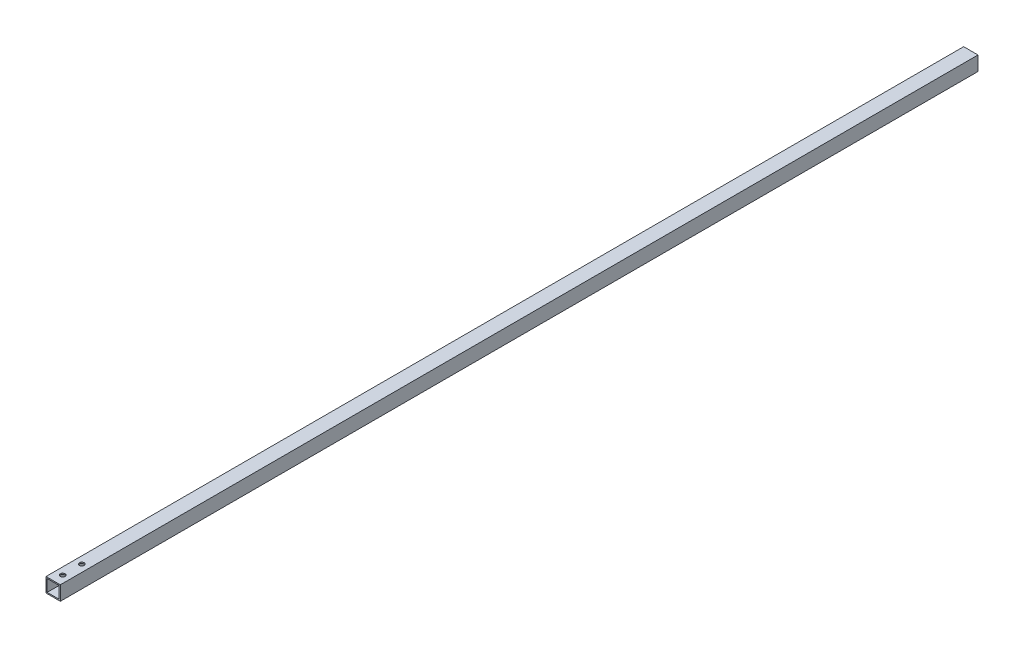
ISO-10303-21;
HEADER;
FILE_DESCRIPTION(('STEP AP214'),'2;1');
FILE_NAME('part.step','',(''),(''),'','','');
FILE_SCHEMA(('AUTOMOTIVE_DESIGN { 1 0 10303 214 1 1 1 1 }'));
ENDSEC;
DATA;
#1=APPLICATION_CONTEXT('core data for automotive mechanical design processes');
#2=APPLICATION_PROTOCOL_DEFINITION('international standard','automotive_design',2000,#1);
#3=PRODUCT_CONTEXT('',#1,'mechanical');
#4=PRODUCT('Part','Part','',(#3));
#5=PRODUCT_RELATED_PRODUCT_CATEGORY('part','',(#4));
#6=PRODUCT_DEFINITION_FORMATION('','',#4);
#7=PRODUCT_DEFINITION_CONTEXT('part definition',#1,'design');
#8=PRODUCT_DEFINITION('design','',#6,#7);
#9=PRODUCT_DEFINITION_SHAPE('','',#8);
#10=(LENGTH_UNIT() NAMED_UNIT(*) SI_UNIT(.MILLI.,.METRE.));
#11=(NAMED_UNIT(*) PLANE_ANGLE_UNIT() SI_UNIT($,.RADIAN.));
#12=(NAMED_UNIT(*) SI_UNIT($,.STERADIAN.) SOLID_ANGLE_UNIT());
#13=UNCERTAINTY_MEASURE_WITH_UNIT(LENGTH_MEASURE(1.E-05),#10,'distance_accuracy_value','');
#14=(GEOMETRIC_REPRESENTATION_CONTEXT(3) GLOBAL_UNCERTAINTY_ASSIGNED_CONTEXT((#13)) GLOBAL_UNIT_ASSIGNED_CONTEXT((#10,
#11,#12)) REPRESENTATION_CONTEXT('',''));
#15=CARTESIAN_POINT('',(0.,0.,0.));
#16=DIRECTION('',(0.,0.,1.));
#17=DIRECTION('',(1.,0.,0.));
#18=AXIS2_PLACEMENT_3D('',#15,#16,#17);
#19=CARTESIAN_POINT('',(0.,0.,609.6));
#20=DIRECTION('',(0.,0.,-1.));
#21=DIRECTION('',(-1.,0.,0.));
#22=AXIS2_PLACEMENT_3D('',#19,#20,#21);
#23=PLANE('',#22);
#24=DIRECTION('',(0.,1.,0.));
#25=VECTOR('',#24,1.);
#26=CARTESIAN_POINT('',(9.525,-9.525,609.6));
#27=LINE('',#26,#25);
#28=CARTESIAN_POINT('',(9.525,-9.525,609.6));
#29=VERTEX_POINT('',#28);
#30=CARTESIAN_POINT('',(9.525,9.525,609.6));
#31=VERTEX_POINT('',#30);
#32=EDGE_CURVE('E138',#29,#31,#27,.T.);
#33=ORIENTED_EDGE('',*,*,#32,.T.);
#34=DIRECTION('',(-1.,0.,0.));
#35=VECTOR('',#34,1.);
#36=CARTESIAN_POINT('',(-9.525,9.525,609.6));
#37=LINE('',#36,#35);
#38=CARTESIAN_POINT('',(-9.525,9.525,609.6));
#39=VERTEX_POINT('',#38);
#40=EDGE_CURVE('E141',#31,#39,#37,.T.);
#41=ORIENTED_EDGE('',*,*,#40,.T.);
#42=DIRECTION('',(0.,-1.,0.));
#43=VECTOR('',#42,1.);
#44=CARTESIAN_POINT('',(-9.525,-9.525,609.6));
#45=LINE('',#44,#43);
#46=CARTESIAN_POINT('',(-9.525,-9.525,609.6));
#47=VERTEX_POINT('',#46);
#48=EDGE_CURVE('E144',#39,#47,#45,.T.);
#49=ORIENTED_EDGE('',*,*,#48,.T.);
#50=DIRECTION('',(1.,0.,0.));
#51=VECTOR('',#50,1.);
#52=CARTESIAN_POINT('',(-9.525,-9.525,609.6));
#53=LINE('',#52,#51);
#54=EDGE_CURVE('E146',#47,#29,#53,.T.);
#55=ORIENTED_EDGE('',*,*,#54,.T.);
#56=EDGE_LOOP('',(#33,#41,#49,#55));
#57=FACE_BOUND('',#56,.T.);
#58=DIRECTION('',(0.,1.,0.));
#59=VECTOR('',#58,1.);
#60=CARTESIAN_POINT('',(7.9375,-7.9375,609.6));
#61=LINE('',#60,#59);
#62=CARTESIAN_POINT('',(7.9375,-7.9375,609.6));
#63=VERTEX_POINT('',#62);
#64=CARTESIAN_POINT('',(7.9375,7.9375,609.6));
#65=VERTEX_POINT('',#64);
#66=EDGE_CURVE('E100',#63,#65,#61,.T.);
#67=ORIENTED_EDGE('',*,*,#66,.F.);
#68=DIRECTION('',(1.,0.,0.));
#69=VECTOR('',#68,1.);
#70=CARTESIAN_POINT('',(-7.9375,-7.9375,609.6));
#71=LINE('',#70,#69);
#72=CARTESIAN_POINT('',(-7.9375,-7.9375,609.6));
#73=VERTEX_POINT('',#72);
#74=EDGE_CURVE('E122',#73,#63,#71,.T.);
#75=ORIENTED_EDGE('',*,*,#74,.F.);
#76=DIRECTION('',(0.,-1.,0.));
#77=VECTOR('',#76,1.);
#78=CARTESIAN_POINT('',(-7.9375,-7.9375,609.6));
#79=LINE('',#78,#77);
#80=CARTESIAN_POINT('',(-7.9375,7.9375,609.6));
#81=VERTEX_POINT('',#80);
#82=EDGE_CURVE('E120',#81,#73,#79,.T.);
#83=ORIENTED_EDGE('',*,*,#82,.F.);
#84=DIRECTION('',(-1.,0.,0.));
#85=VECTOR('',#84,1.);
#86=CARTESIAN_POINT('',(-7.9375,7.9375,609.6));
#87=LINE('',#86,#85);
#88=EDGE_CURVE('E108',#65,#81,#87,.T.);
#89=ORIENTED_EDGE('',*,*,#88,.F.);
#90=EDGE_LOOP('',(#67,#75,#83,#89));
#91=FACE_BOUND('',#90,.T.);
#92=ADVANCED_FACE('F33',(#57,#91),#23,.F.);
#93=CARTESIAN_POINT('',(0.,0.,-609.6));
#94=DIRECTION('',(0.,0.,-1.));
#95=DIRECTION('',(-1.,0.,0.));
#96=AXIS2_PLACEMENT_3D('',#93,#94,#95);
#97=PLANE('',#96);
#98=DIRECTION('',(0.,1.,0.));
#99=VECTOR('',#98,1.);
#100=CARTESIAN_POINT('',(9.525,-9.525,-609.6));
#101=LINE('',#100,#99);
#102=CARTESIAN_POINT('',(9.525,-9.525,-609.6));
#103=VERTEX_POINT('',#102);
#104=CARTESIAN_POINT('',(9.525,9.525,-609.6));
#105=VERTEX_POINT('',#104);
#106=EDGE_CURVE('E116',#103,#105,#101,.T.);
#107=ORIENTED_EDGE('',*,*,#106,.F.);
#108=DIRECTION('',(1.,0.,0.));
#109=VECTOR('',#108,1.);
#110=CARTESIAN_POINT('',(-9.525,-9.525,-609.6));
#111=LINE('',#110,#109);
#112=CARTESIAN_POINT('',(-9.525,-9.525,-609.6));
#113=VERTEX_POINT('',#112);
#114=EDGE_CURVE('E142',#113,#103,#111,.T.);
#115=ORIENTED_EDGE('',*,*,#114,.F.);
#116=DIRECTION('',(0.,-1.,0.));
#117=VECTOR('',#116,1.);
#118=CARTESIAN_POINT('',(-9.525,-9.525,-609.6));
#119=LINE('',#118,#117);
#120=CARTESIAN_POINT('',(-9.525,9.525,-609.6));
#121=VERTEX_POINT('',#120);
#122=EDGE_CURVE('E153',#121,#113,#119,.T.);
#123=ORIENTED_EDGE('',*,*,#122,.F.);
#124=DIRECTION('',(-1.,0.,0.));
#125=VECTOR('',#124,1.);
#126=CARTESIAN_POINT('',(-9.525,9.525,-609.6));
#127=LINE('',#126,#125);
#128=EDGE_CURVE('E151',#105,#121,#127,.T.);
#129=ORIENTED_EDGE('',*,*,#128,.F.);
#130=EDGE_LOOP('',(#107,#115,#123,#129));
#131=FACE_BOUND('',#130,.T.);
#132=DIRECTION('',(1.,0.,0.));
#133=VECTOR('',#132,1.);
#134=CARTESIAN_POINT('',(-7.9375,-7.9375,-609.6));
#135=LINE('',#134,#133);
#136=CARTESIAN_POINT('',(-7.9375,-7.9375,-609.6));
#137=VERTEX_POINT('',#136);
#138=CARTESIAN_POINT('',(7.9375,-7.9375,-609.6));
#139=VERTEX_POINT('',#138);
#140=EDGE_CURVE('E109',#137,#139,#135,.T.);
#141=ORIENTED_EDGE('',*,*,#140,.T.);
#142=DIRECTION('',(0.,1.,0.));
#143=VECTOR('',#142,1.);
#144=CARTESIAN_POINT('',(7.9375,-7.9375,-609.6));
#145=LINE('',#144,#143);
#146=CARTESIAN_POINT('',(7.9375,7.9375,-609.6));
#147=VERTEX_POINT('',#146);
#148=EDGE_CURVE('E58',#139,#147,#145,.T.);
#149=ORIENTED_EDGE('',*,*,#148,.T.);
#150=DIRECTION('',(-1.,0.,0.));
#151=VECTOR('',#150,1.);
#152=CARTESIAN_POINT('',(-7.9375,7.9375,-609.6));
#153=LINE('',#152,#151);
#154=CARTESIAN_POINT('',(-7.9375,7.9375,-609.6));
#155=VERTEX_POINT('',#154);
#156=EDGE_CURVE('E115',#147,#155,#153,.T.);
#157=ORIENTED_EDGE('',*,*,#156,.T.);
#158=DIRECTION('',(0.,-1.,0.));
#159=VECTOR('',#158,1.);
#160=CARTESIAN_POINT('',(-7.9375,-7.9375,-609.6));
#161=LINE('',#160,#159);
#162=EDGE_CURVE('E130',#155,#137,#161,.T.);
#163=ORIENTED_EDGE('',*,*,#162,.T.);
#164=EDGE_LOOP('',(#141,#149,#157,#163));
#165=FACE_BOUND('',#164,.T.);
#166=ADVANCED_FACE('F200',(#131,#165),#97,.T.);
#167=CARTESIAN_POINT('',(9.525,-9.525,609.6));
#168=DIRECTION('',(-1.,0.,0.));
#169=DIRECTION('',(0.,0.,1.));
#170=AXIS2_PLACEMENT_3D('',#167,#168,#169);
#171=PLANE('',#170);
#172=ORIENTED_EDGE('',*,*,#106,.T.);
#173=DIRECTION('',(0.,0.,-1.));
#174=VECTOR('',#173,1.);
#175=CARTESIAN_POINT('',(9.525,9.525,609.6));
#176=LINE('',#175,#174);
#177=EDGE_CURVE('E11',#31,#105,#176,.T.);
#178=ORIENTED_EDGE('',*,*,#177,.F.);
#179=ORIENTED_EDGE('',*,*,#32,.F.);
#180=DIRECTION('',(0.,0.,-1.));
#181=VECTOR('',#180,1.);
#182=CARTESIAN_POINT('',(9.525,-9.525,609.6));
#183=LINE('',#182,#181);
#184=EDGE_CURVE('E148',#29,#103,#183,.T.);
#185=ORIENTED_EDGE('',*,*,#184,.T.);
#186=EDGE_LOOP('',(#172,#178,#179,#185));
#187=FACE_BOUND('',#186,.T.);
#188=ADVANCED_FACE('F35',(#187),#171,.F.);
#189=CARTESIAN_POINT('',(-9.525,9.525,609.6));
#190=DIRECTION('',(0.,-1.,0.));
#191=DIRECTION('',(0.,0.,-1.));
#192=AXIS2_PLACEMENT_3D('',#189,#190,#191);
#193=PLANE('',#192);
#194=CARTESIAN_POINT('',(0.,9.525,596.9));
#195=DIRECTION('',(0.,1.,0.));
#196=DIRECTION('',(0.,0.,1.));
#197=AXIS2_PLACEMENT_3D('',#194,#195,#196);
#198=CIRCLE('',#197,3.175);
#199=CARTESIAN_POINT('',(0.,9.525,600.075));
#200=VERTEX_POINT('',#199);
#201=EDGE_CURVE('E171',#200,#200,#198,.T.);
#202=ORIENTED_EDGE('',*,*,#201,.F.);
#203=EDGE_LOOP('',(#202));
#204=FACE_BOUND('',#203,.T.);
#205=CARTESIAN_POINT('',(0.,9.525,571.5));
#206=DIRECTION('',(0.,1.,0.));
#207=DIRECTION('',(0.,0.,1.));
#208=AXIS2_PLACEMENT_3D('',#205,#206,#207);
#209=CIRCLE('',#208,3.175);
#210=CARTESIAN_POINT('',(0.,9.525,574.675));
#211=VERTEX_POINT('',#210);
#212=EDGE_CURVE('E179',#211,#211,#209,.T.);
#213=ORIENTED_EDGE('',*,*,#212,.F.);
#214=EDGE_LOOP('',(#213));
#215=FACE_BOUND('',#214,.T.);
#216=ORIENTED_EDGE('',*,*,#128,.T.);
#217=DIRECTION('',(0.,0.,-1.));
#218=VECTOR('',#217,1.);
#219=CARTESIAN_POINT('',(-9.525,9.525,609.6));
#220=LINE('',#219,#218);
#221=EDGE_CURVE('E42',#39,#121,#220,.T.);
#222=ORIENTED_EDGE('',*,*,#221,.F.);
#223=ORIENTED_EDGE('',*,*,#40,.F.);
#224=ORIENTED_EDGE('',*,*,#177,.T.);
#225=EDGE_LOOP('',(#216,#222,#223,#224));
#226=FACE_BOUND('',#225,.T.);
#227=ADVANCED_FACE('F224',(#204,#215,#226),#193,.F.);
#228=CARTESIAN_POINT('',(-9.525,-9.525,609.6));
#229=DIRECTION('',(1.,0.,0.));
#230=DIRECTION('',(0.,0.,-1.));
#231=AXIS2_PLACEMENT_3D('',#228,#229,#230);
#232=PLANE('',#231);
#233=ORIENTED_EDGE('',*,*,#122,.T.);
#234=DIRECTION('',(0.,0.,-1.));
#235=VECTOR('',#234,1.);
#236=CARTESIAN_POINT('',(-9.525,-9.525,609.6));
#237=LINE('',#236,#235);
#238=EDGE_CURVE('E158',#47,#113,#237,.T.);
#239=ORIENTED_EDGE('',*,*,#238,.F.);
#240=ORIENTED_EDGE('',*,*,#48,.F.);
#241=ORIENTED_EDGE('',*,*,#221,.T.);
#242=EDGE_LOOP('',(#233,#239,#240,#241));
#243=FACE_BOUND('',#242,.T.);
#244=ADVANCED_FACE('F222',(#243),#232,.F.);
#245=CARTESIAN_POINT('',(-9.525,-9.525,609.6));
#246=DIRECTION('',(0.,1.,0.));
#247=DIRECTION('',(0.,0.,1.));
#248=AXIS2_PLACEMENT_3D('',#245,#246,#247);
#249=PLANE('',#248);
#250=CARTESIAN_POINT('',(0.,-9.525,596.9));
#251=DIRECTION('',(0.,1.,0.));
#252=DIRECTION('',(0.,0.,1.));
#253=AXIS2_PLACEMENT_3D('',#250,#251,#252);
#254=CIRCLE('',#253,3.175);
#255=CARTESIAN_POINT('',(0.,-9.525,600.075));
#256=VERTEX_POINT('',#255);
#257=EDGE_CURVE('E165',#256,#256,#254,.T.);
#258=ORIENTED_EDGE('',*,*,#257,.T.);
#259=EDGE_LOOP('',(#258));
#260=FACE_BOUND('',#259,.T.);
#261=CARTESIAN_POINT('',(0.,-9.525,571.5));
#262=DIRECTION('',(0.,1.,0.));
#263=DIRECTION('',(0.,0.,1.));
#264=AXIS2_PLACEMENT_3D('',#261,#262,#263);
#265=CIRCLE('',#264,3.175);
#266=CARTESIAN_POINT('',(0.,-9.525,574.675));
#267=VERTEX_POINT('',#266);
#268=EDGE_CURVE('E176',#267,#267,#265,.T.);
#269=ORIENTED_EDGE('',*,*,#268,.T.);
#270=EDGE_LOOP('',(#269));
#271=FACE_BOUND('',#270,.T.);
#272=ORIENTED_EDGE('',*,*,#114,.T.);
#273=ORIENTED_EDGE('',*,*,#184,.F.);
#274=ORIENTED_EDGE('',*,*,#54,.F.);
#275=ORIENTED_EDGE('',*,*,#238,.T.);
#276=EDGE_LOOP('',(#272,#273,#274,#275));
#277=FACE_BOUND('',#276,.T.);
#278=ADVANCED_FACE('F219',(#260,#271,#277),#249,.F.);
#279=CARTESIAN_POINT('',(7.9375,-7.9375,609.6));
#280=DIRECTION('',(-1.,0.,0.));
#281=DIRECTION('',(0.,0.,1.));
#282=AXIS2_PLACEMENT_3D('',#279,#280,#281);
#283=PLANE('',#282);
#284=ORIENTED_EDGE('',*,*,#148,.F.);
#285=DIRECTION('',(0.,0.,-1.));
#286=VECTOR('',#285,1.);
#287=CARTESIAN_POINT('',(7.9375,-7.9375,609.6));
#288=LINE('',#287,#286);
#289=EDGE_CURVE('E104',#63,#139,#288,.T.);
#290=ORIENTED_EDGE('',*,*,#289,.F.);
#291=ORIENTED_EDGE('',*,*,#66,.T.);
#292=DIRECTION('',(0.,0.,-1.));
#293=VECTOR('',#292,1.);
#294=CARTESIAN_POINT('',(7.9375,7.9375,609.6));
#295=LINE('',#294,#293);
#296=EDGE_CURVE('E103',#65,#147,#295,.T.);
#297=ORIENTED_EDGE('',*,*,#296,.T.);
#298=EDGE_LOOP('',(#284,#290,#291,#297));
#299=FACE_BOUND('',#298,.T.);
#300=ADVANCED_FACE('F102',(#299),#283,.T.);
#301=CARTESIAN_POINT('',(-7.9375,7.9375,609.6));
#302=DIRECTION('',(0.,-1.,0.));
#303=DIRECTION('',(0.,0.,-1.));
#304=AXIS2_PLACEMENT_3D('',#301,#302,#303);
#305=PLANE('',#304);
#306=CARTESIAN_POINT('',(0.,7.93749999999999,596.9));
#307=DIRECTION('',(0.,-1.,0.));
#308=DIRECTION('',(0.,0.,-1.));
#309=AXIS2_PLACEMENT_3D('',#306,#307,#308);
#310=CIRCLE('',#309,3.175);
#311=CARTESIAN_POINT('',(0.,7.93749999999999,600.075));
#312=VERTEX_POINT('',#311);
#313=EDGE_CURVE('E128',#312,#312,#310,.T.);
#314=ORIENTED_EDGE('',*,*,#313,.F.);
#315=EDGE_LOOP('',(#314));
#316=FACE_BOUND('',#315,.T.);
#317=CARTESIAN_POINT('',(0.,7.93749999999999,571.5));
#318=DIRECTION('',(0.,-1.,0.));
#319=DIRECTION('',(0.,0.,-1.));
#320=AXIS2_PLACEMENT_3D('',#317,#318,#319);
#321=CIRCLE('',#320,3.175);
#322=CARTESIAN_POINT('',(0.,7.93749999999999,574.675));
#323=VERTEX_POINT('',#322);
#324=EDGE_CURVE('E164',#323,#323,#321,.T.);
#325=ORIENTED_EDGE('',*,*,#324,.F.);
#326=EDGE_LOOP('',(#325));
#327=FACE_BOUND('',#326,.T.);
#328=ORIENTED_EDGE('',*,*,#156,.F.);
#329=ORIENTED_EDGE('',*,*,#296,.F.);
#330=ORIENTED_EDGE('',*,*,#88,.T.);
#331=DIRECTION('',(0.,0.,-1.));
#332=VECTOR('',#331,1.);
#333=CARTESIAN_POINT('',(-7.9375,7.9375,609.6));
#334=LINE('',#333,#332);
#335=EDGE_CURVE('E117',#81,#155,#334,.T.);
#336=ORIENTED_EDGE('',*,*,#335,.T.);
#337=EDGE_LOOP('',(#328,#329,#330,#336));
#338=FACE_BOUND('',#337,.T.);
#339=ADVANCED_FACE('F112',(#316,#327,#338),#305,.T.);
#340=CARTESIAN_POINT('',(-7.9375,-7.9375,609.6));
#341=DIRECTION('',(1.,0.,0.));
#342=DIRECTION('',(0.,0.,-1.));
#343=AXIS2_PLACEMENT_3D('',#340,#341,#342);
#344=PLANE('',#343);
#345=ORIENTED_EDGE('',*,*,#162,.F.);
#346=ORIENTED_EDGE('',*,*,#335,.F.);
#347=ORIENTED_EDGE('',*,*,#82,.T.);
#348=DIRECTION('',(0.,0.,-1.));
#349=VECTOR('',#348,1.);
#350=CARTESIAN_POINT('',(-7.9375,-7.9375,609.6));
#351=LINE('',#350,#349);
#352=EDGE_CURVE('E50',#73,#137,#351,.T.);
#353=ORIENTED_EDGE('',*,*,#352,.T.);
#354=EDGE_LOOP('',(#345,#346,#347,#353));
#355=FACE_BOUND('',#354,.T.);
#356=ADVANCED_FACE('F196',(#355),#344,.T.);
#357=CARTESIAN_POINT('',(-7.9375,-7.9375,609.6));
#358=DIRECTION('',(0.,1.,0.));
#359=DIRECTION('',(0.,0.,1.));
#360=AXIS2_PLACEMENT_3D('',#357,#358,#359);
#361=PLANE('',#360);
#362=CARTESIAN_POINT('',(0.,-7.9375,596.9));
#363=DIRECTION('',(0.,1.,0.));
#364=DIRECTION('',(0.,0.,1.));
#365=AXIS2_PLACEMENT_3D('',#362,#363,#364);
#366=CIRCLE('',#365,3.175);
#367=CARTESIAN_POINT('',(0.,-7.9375,600.075));
#368=VERTEX_POINT('',#367);
#369=EDGE_CURVE('E37',#368,#368,#366,.T.);
#370=ORIENTED_EDGE('',*,*,#369,.F.);
#371=EDGE_LOOP('',(#370));
#372=FACE_BOUND('',#371,.T.);
#373=CARTESIAN_POINT('',(0.,-7.9375,571.5));
#374=DIRECTION('',(0.,1.,0.));
#375=DIRECTION('',(0.,0.,1.));
#376=AXIS2_PLACEMENT_3D('',#373,#374,#375);
#377=CIRCLE('',#376,3.175);
#378=CARTESIAN_POINT('',(0.,-7.9375,574.675));
#379=VERTEX_POINT('',#378);
#380=EDGE_CURVE('E162',#379,#379,#377,.T.);
#381=ORIENTED_EDGE('',*,*,#380,.F.);
#382=EDGE_LOOP('',(#381));
#383=FACE_BOUND('',#382,.T.);
#384=ORIENTED_EDGE('',*,*,#140,.F.);
#385=ORIENTED_EDGE('',*,*,#352,.F.);
#386=ORIENTED_EDGE('',*,*,#74,.T.);
#387=ORIENTED_EDGE('',*,*,#289,.T.);
#388=EDGE_LOOP('',(#384,#385,#386,#387));
#389=FACE_BOUND('',#388,.T.);
#390=ADVANCED_FACE('F192',(#372,#383,#389),#361,.T.);
#391=CARTESIAN_POINT('',(0.,-9.525,571.5));
#392=DIRECTION('',(0.,1.,0.));
#393=DIRECTION('',(0.,0.,1.));
#394=AXIS2_PLACEMENT_3D('',#391,#392,#393);
#395=CYLINDRICAL_SURFACE('',#394,3.175);
#396=CARTESIAN_POINT('',(0.,-7.9375,574.675));
#397=CARTESIAN_POINT('',(0.,-7.95403645833333,574.675));
#398=CARTESIAN_POINT('',(0.,-7.97057291666667,574.675));
#399=CARTESIAN_POINT('',(0.,-8.00364583333333,574.675));
#400=CARTESIAN_POINT('',(0.,-8.02018229166667,574.675));
#401=CARTESIAN_POINT('',(0.,-8.05325520833333,574.675));
#402=CARTESIAN_POINT('',(0.,-8.06979166666667,574.675));
#403=CARTESIAN_POINT('',(0.,-8.10286458333333,574.675));
#404=CARTESIAN_POINT('',(0.,-8.11940104166667,574.675));
#405=CARTESIAN_POINT('',(0.,-8.15247395833333,574.675));
#406=CARTESIAN_POINT('',(0.,-8.16901041666667,574.675));
#407=CARTESIAN_POINT('',(0.,-8.20208333333333,574.675));
#408=CARTESIAN_POINT('',(0.,-8.21861979166667,574.675));
#409=CARTESIAN_POINT('',(0.,-8.25169270833333,574.675));
#410=CARTESIAN_POINT('',(0.,-8.26822916666667,574.675));
#411=CARTESIAN_POINT('',(0.,-8.30130208333333,574.675));
#412=CARTESIAN_POINT('',(0.,-8.31783854166667,574.675));
#413=CARTESIAN_POINT('',(0.,-8.35091145833333,574.675));
#414=CARTESIAN_POINT('',(0.,-8.36744791666667,574.675));
#415=CARTESIAN_POINT('',(0.,-8.40052083333333,574.675));
#416=CARTESIAN_POINT('',(0.,-8.41705729166667,574.675));
#417=CARTESIAN_POINT('',(0.,-8.45013020833333,574.675));
#418=CARTESIAN_POINT('',(0.,-8.46666666666667,574.675));
#419=CARTESIAN_POINT('',(0.,-8.49973958333333,574.675));
#420=CARTESIAN_POINT('',(0.,-8.51627604166667,574.675));
#421=CARTESIAN_POINT('',(0.,-8.54934895833333,574.675));
#422=CARTESIAN_POINT('',(0.,-8.56588541666667,574.675));
#423=CARTESIAN_POINT('',(0.,-8.59895833333333,574.675));
#424=CARTESIAN_POINT('',(0.,-8.61549479166667,574.675));
#425=CARTESIAN_POINT('',(0.,-8.64856770833333,574.675));
#426=CARTESIAN_POINT('',(0.,-8.66510416666667,574.675));
#427=CARTESIAN_POINT('',(0.,-8.69817708333333,574.675));
#428=CARTESIAN_POINT('',(0.,-8.71471354166667,574.675));
#429=CARTESIAN_POINT('',(0.,-8.74778645833333,574.675));
#430=CARTESIAN_POINT('',(0.,-8.76432291666667,574.675));
#431=CARTESIAN_POINT('',(0.,-8.79739583333333,574.675));
#432=CARTESIAN_POINT('',(0.,-8.81393229166667,574.675));
#433=CARTESIAN_POINT('',(0.,-8.84700520833333,574.675));
#434=CARTESIAN_POINT('',(0.,-8.86354166666667,574.675));
#435=CARTESIAN_POINT('',(0.,-8.89661458333333,574.675));
#436=CARTESIAN_POINT('',(0.,-8.91315104166667,574.675));
#437=CARTESIAN_POINT('',(0.,-8.94622395833333,574.675));
#438=CARTESIAN_POINT('',(0.,-8.96276041666667,574.675));
#439=CARTESIAN_POINT('',(0.,-8.99583333333334,574.675));
#440=CARTESIAN_POINT('',(0.,-9.01236979166667,574.675));
#441=CARTESIAN_POINT('',(0.,-9.04544270833333,574.675));
#442=CARTESIAN_POINT('',(0.,-9.06197916666667,574.675));
#443=CARTESIAN_POINT('',(0.,-9.09505208333333,574.675));
#444=CARTESIAN_POINT('',(0.,-9.11158854166667,574.675));
#445=CARTESIAN_POINT('',(0.,-9.14466145833333,574.675));
#446=CARTESIAN_POINT('',(0.,-9.16119791666667,574.675));
#447=CARTESIAN_POINT('',(0.,-9.19427083333333,574.675));
#448=CARTESIAN_POINT('',(0.,-9.21080729166667,574.675));
#449=CARTESIAN_POINT('',(0.,-9.24388020833333,574.675));
#450=CARTESIAN_POINT('',(0.,-9.26041666666667,574.675));
#451=CARTESIAN_POINT('',(0.,-9.29348958333333,574.675));
#452=CARTESIAN_POINT('',(0.,-9.31002604166667,574.675));
#453=CARTESIAN_POINT('',(0.,-9.34309895833333,574.675));
#454=CARTESIAN_POINT('',(0.,-9.35963541666667,574.675));
#455=CARTESIAN_POINT('',(0.,-9.39270833333333,574.675));
#456=CARTESIAN_POINT('',(0.,-9.40924479166667,574.675));
#457=CARTESIAN_POINT('',(0.,-9.44231770833333,574.675));
#458=CARTESIAN_POINT('',(0.,-9.45885416666667,574.675));
#459=CARTESIAN_POINT('',(0.,-9.49192708333333,574.675));
#460=CARTESIAN_POINT('',(0.,-9.50846354166667,574.675));
#461=CARTESIAN_POINT('',(0.,-9.525,574.675));
#462=B_SPLINE_CURVE_WITH_KNOTS('',3,(#396,#397,#398,#399,#400,#401,#402,#403,#404,#405,#406,
#407,#408,#409,#410,#411,#412,#413,#414,#415,#416,#417,#418,#419,#420,#421,#422,#423,#424,#425,
#426,#427,#428,#429,#430,#431,#432,#433,#434,#435,#436,#437,#438,#439,#440,#441,#442,#443,#444,
#445,#446,#447,#448,#449,#450,#451,#452,#453,#454,#455,#456,#457,#458,#459,#460,#461),
.UNSPECIFIED.,.F.,.F.,(4,2,2,2,2,2,2,2,2,2,2,2,2,2,2,2,2,2,2,2,2,2,2,2,2,2,2,2,2,2,2,2,4),(0.,
0.0496093750000006,0.0992187500000012,0.148828125000002,0.198437500000001,0.248046875000001,
0.297656250000002,0.347265625000001,0.396875000000001,0.446484375000002,0.496093750000001,
0.545703125000002,0.595312500000002,0.644921875000001,0.694531250000002,0.744140625000002,
0.793750000000001,0.843359375000002,0.892968750000002,0.942578125000001,0.992187500000002,
1.041796875,1.09140625,1.141015625,1.190625,1.240234375,1.28984375,1.339453125,1.3890625,
1.438671875,1.48828125,1.537890625,1.5875),.UNSPECIFIED.);
#463=EDGE_CURVE('BSEAM195',#379,#267,#462,.T.);
#464=ORIENTED_EDGE('',*,*,#380,.T.);
#465=ORIENTED_EDGE('',*,*,#268,.F.);
#466=ORIENTED_EDGE('',*,*,#463,.T.);
#467=ORIENTED_EDGE('',*,*,#463,.F.);
#468=EDGE_LOOP('',(#464,#466,#465,#467));
#469=FACE_BOUND('',#468,.T.);
#470=ADVANCED_FACE('F195',(#469),#395,.F.);
#471=CARTESIAN_POINT('',(0.,-9.525,596.9));
#472=DIRECTION('',(0.,1.,0.));
#473=DIRECTION('',(0.,0.,1.));
#474=AXIS2_PLACEMENT_3D('',#471,#472,#473);
#475=CYLINDRICAL_SURFACE('',#474,3.175);
#476=CARTESIAN_POINT('',(0.,-7.9375,600.075));
#477=CARTESIAN_POINT('',(0.,-7.95403645833333,600.075));
#478=CARTESIAN_POINT('',(0.,-7.97057291666667,600.075));
#479=CARTESIAN_POINT('',(0.,-8.00364583333333,600.075));
#480=CARTESIAN_POINT('',(0.,-8.02018229166667,600.075));
#481=CARTESIAN_POINT('',(0.,-8.05325520833333,600.075));
#482=CARTESIAN_POINT('',(0.,-8.06979166666667,600.075));
#483=CARTESIAN_POINT('',(0.,-8.10286458333333,600.075));
#484=CARTESIAN_POINT('',(0.,-8.11940104166667,600.075));
#485=CARTESIAN_POINT('',(0.,-8.15247395833333,600.075));
#486=CARTESIAN_POINT('',(0.,-8.16901041666667,600.075));
#487=CARTESIAN_POINT('',(0.,-8.20208333333333,600.075));
#488=CARTESIAN_POINT('',(0.,-8.21861979166667,600.075));
#489=CARTESIAN_POINT('',(0.,-8.25169270833333,600.075));
#490=CARTESIAN_POINT('',(0.,-8.26822916666667,600.075));
#491=CARTESIAN_POINT('',(0.,-8.30130208333333,600.075));
#492=CARTESIAN_POINT('',(0.,-8.31783854166667,600.075));
#493=CARTESIAN_POINT('',(0.,-8.35091145833333,600.075));
#494=CARTESIAN_POINT('',(0.,-8.36744791666667,600.075));
#495=CARTESIAN_POINT('',(0.,-8.40052083333333,600.075));
#496=CARTESIAN_POINT('',(0.,-8.41705729166667,600.075));
#497=CARTESIAN_POINT('',(0.,-8.45013020833333,600.075));
#498=CARTESIAN_POINT('',(0.,-8.46666666666667,600.075));
#499=CARTESIAN_POINT('',(0.,-8.49973958333333,600.075));
#500=CARTESIAN_POINT('',(0.,-8.51627604166667,600.075));
#501=CARTESIAN_POINT('',(0.,-8.54934895833333,600.075));
#502=CARTESIAN_POINT('',(0.,-8.56588541666667,600.075));
#503=CARTESIAN_POINT('',(0.,-8.59895833333333,600.075));
#504=CARTESIAN_POINT('',(0.,-8.61549479166667,600.075));
#505=CARTESIAN_POINT('',(0.,-8.64856770833333,600.075));
#506=CARTESIAN_POINT('',(0.,-8.66510416666667,600.075));
#507=CARTESIAN_POINT('',(0.,-8.69817708333333,600.075));
#508=CARTESIAN_POINT('',(0.,-8.71471354166667,600.075));
#509=CARTESIAN_POINT('',(0.,-8.74778645833333,600.075));
#510=CARTESIAN_POINT('',(0.,-8.76432291666667,600.075));
#511=CARTESIAN_POINT('',(0.,-8.79739583333333,600.075));
#512=CARTESIAN_POINT('',(0.,-8.81393229166667,600.075));
#513=CARTESIAN_POINT('',(0.,-8.84700520833333,600.075));
#514=CARTESIAN_POINT('',(0.,-8.86354166666667,600.075));
#515=CARTESIAN_POINT('',(0.,-8.89661458333333,600.075));
#516=CARTESIAN_POINT('',(0.,-8.91315104166667,600.075));
#517=CARTESIAN_POINT('',(0.,-8.94622395833333,600.075));
#518=CARTESIAN_POINT('',(0.,-8.96276041666667,600.075));
#519=CARTESIAN_POINT('',(0.,-8.99583333333334,600.075));
#520=CARTESIAN_POINT('',(0.,-9.01236979166667,600.075));
#521=CARTESIAN_POINT('',(0.,-9.04544270833333,600.075));
#522=CARTESIAN_POINT('',(0.,-9.06197916666667,600.075));
#523=CARTESIAN_POINT('',(0.,-9.09505208333333,600.075));
#524=CARTESIAN_POINT('',(0.,-9.11158854166667,600.075));
#525=CARTESIAN_POINT('',(0.,-9.14466145833333,600.075));
#526=CARTESIAN_POINT('',(0.,-9.16119791666667,600.075));
#527=CARTESIAN_POINT('',(0.,-9.19427083333333,600.075));
#528=CARTESIAN_POINT('',(0.,-9.21080729166667,600.075));
#529=CARTESIAN_POINT('',(0.,-9.24388020833333,600.075));
#530=CARTESIAN_POINT('',(0.,-9.26041666666667,600.075));
#531=CARTESIAN_POINT('',(0.,-9.29348958333333,600.075));
#532=CARTESIAN_POINT('',(0.,-9.31002604166667,600.075));
#533=CARTESIAN_POINT('',(0.,-9.34309895833333,600.075));
#534=CARTESIAN_POINT('',(0.,-9.35963541666667,600.075));
#535=CARTESIAN_POINT('',(0.,-9.39270833333333,600.075));
#536=CARTESIAN_POINT('',(0.,-9.40924479166667,600.075));
#537=CARTESIAN_POINT('',(0.,-9.44231770833333,600.075));
#538=CARTESIAN_POINT('',(0.,-9.45885416666667,600.075));
#539=CARTESIAN_POINT('',(0.,-9.49192708333333,600.075));
#540=CARTESIAN_POINT('',(0.,-9.50846354166667,600.075));
#541=CARTESIAN_POINT('',(0.,-9.525,600.075));
#542=B_SPLINE_CURVE_WITH_KNOTS('',3,(#476,#477,#478,#479,#480,#481,#482,#483,#484,#485,#486,
#487,#488,#489,#490,#491,#492,#493,#494,#495,#496,#497,#498,#499,#500,#501,#502,#503,#504,#505,
#506,#507,#508,#509,#510,#511,#512,#513,#514,#515,#516,#517,#518,#519,#520,#521,#522,#523,#524,
#525,#526,#527,#528,#529,#530,#531,#532,#533,#534,#535,#536,#537,#538,#539,#540,#541),
.UNSPECIFIED.,.F.,.F.,(4,2,2,2,2,2,2,2,2,2,2,2,2,2,2,2,2,2,2,2,2,2,2,2,2,2,2,2,2,2,2,2,4),(0.,
0.0496093750000006,0.0992187500000012,0.148828125000002,0.198437500000001,0.248046875000001,
0.297656250000002,0.347265625000001,0.396875000000001,0.446484375000002,0.496093750000001,
0.545703125000002,0.595312500000002,0.644921875000001,0.694531250000002,0.744140625000002,
0.793750000000001,0.843359375000002,0.892968750000002,0.942578125000001,0.992187500000002,
1.041796875,1.09140625,1.141015625,1.190625,1.240234375,1.28984375,1.339453125,1.3890625,
1.438671875,1.48828125,1.537890625,1.5875),.UNSPECIFIED.);
#543=EDGE_CURVE('BSEAM189',#368,#256,#542,.T.);
#544=ORIENTED_EDGE('',*,*,#369,.T.);
#545=ORIENTED_EDGE('',*,*,#257,.F.);
#546=ORIENTED_EDGE('',*,*,#543,.T.);
#547=ORIENTED_EDGE('',*,*,#543,.F.);
#548=EDGE_LOOP('',(#544,#546,#545,#547));
#549=FACE_BOUND('',#548,.T.);
#550=ADVANCED_FACE('F189',(#549),#475,.F.);
#551=CARTESIAN_POINT('',(0.,7.93749999999999,574.675));
#552=CARTESIAN_POINT('',(0.,7.95403645833333,574.675));
#553=CARTESIAN_POINT('',(0.,7.97057291666666,574.675));
#554=CARTESIAN_POINT('',(0.,8.00364583333333,574.675));
#555=CARTESIAN_POINT('',(0.,8.02018229166666,574.675));
#556=CARTESIAN_POINT('',(0.,8.05325520833333,574.675));
#557=CARTESIAN_POINT('',(0.,8.06979166666666,574.675));
#558=CARTESIAN_POINT('',(0.,8.10286458333333,574.675));
#559=CARTESIAN_POINT('',(0.,8.11940104166666,574.675));
#560=CARTESIAN_POINT('',(0.,8.15247395833333,574.675));
#561=CARTESIAN_POINT('',(0.,8.16901041666666,574.675));
#562=CARTESIAN_POINT('',(0.,8.20208333333333,574.675));
#563=CARTESIAN_POINT('',(0.,8.21861979166666,574.675));
#564=CARTESIAN_POINT('',(0.,8.25169270833333,574.675));
#565=CARTESIAN_POINT('',(0.,8.26822916666666,574.675));
#566=CARTESIAN_POINT('',(0.,8.30130208333333,574.675));
#567=CARTESIAN_POINT('',(0.,8.31783854166666,574.675));
#568=CARTESIAN_POINT('',(0.,8.35091145833333,574.675));
#569=CARTESIAN_POINT('',(0.,8.36744791666666,574.675));
#570=CARTESIAN_POINT('',(0.,8.40052083333333,574.675));
#571=CARTESIAN_POINT('',(0.,8.41705729166666,574.675));
#572=CARTESIAN_POINT('',(0.,8.45013020833333,574.675));
#573=CARTESIAN_POINT('',(0.,8.46666666666666,574.675));
#574=CARTESIAN_POINT('',(0.,8.49973958333333,574.675));
#575=CARTESIAN_POINT('',(0.,8.51627604166666,574.675));
#576=CARTESIAN_POINT('',(0.,8.54934895833333,574.675));
#577=CARTESIAN_POINT('',(0.,8.56588541666666,574.675));
#578=CARTESIAN_POINT('',(0.,8.59895833333333,574.675));
#579=CARTESIAN_POINT('',(0.,8.61549479166666,574.675));
#580=CARTESIAN_POINT('',(0.,8.64856770833333,574.675));
#581=CARTESIAN_POINT('',(0.,8.66510416666666,574.675));
#582=CARTESIAN_POINT('',(0.,8.69817708333333,574.675));
#583=CARTESIAN_POINT('',(0.,8.71471354166667,574.675));
#584=CARTESIAN_POINT('',(0.,8.74778645833333,574.675));
#585=CARTESIAN_POINT('',(0.,8.76432291666666,574.675));
#586=CARTESIAN_POINT('',(0.,8.79739583333333,574.675));
#587=CARTESIAN_POINT('',(0.,8.81393229166667,574.675));
#588=CARTESIAN_POINT('',(0.,8.84700520833333,574.675));
#589=CARTESIAN_POINT('',(0.,8.86354166666666,574.675));
#590=CARTESIAN_POINT('',(0.,8.89661458333333,574.675));
#591=CARTESIAN_POINT('',(0.,8.91315104166667,574.675));
#592=CARTESIAN_POINT('',(0.,8.94622395833333,574.675));
#593=CARTESIAN_POINT('',(0.,8.96276041666667,574.675));
#594=CARTESIAN_POINT('',(0.,8.99583333333333,574.675));
#595=CARTESIAN_POINT('',(0.,9.01236979166667,574.675));
#596=CARTESIAN_POINT('',(0.,9.04544270833333,574.675));
#597=CARTESIAN_POINT('',(0.,9.06197916666667,574.675));
#598=CARTESIAN_POINT('',(0.,9.09505208333333,574.675));
#599=CARTESIAN_POINT('',(0.,9.11158854166667,574.675));
#600=CARTESIAN_POINT('',(0.,9.14466145833333,574.675));
#601=CARTESIAN_POINT('',(0.,9.16119791666667,574.675));
#602=CARTESIAN_POINT('',(0.,9.19427083333333,574.675));
#603=CARTESIAN_POINT('',(0.,9.21080729166667,574.675));
#604=CARTESIAN_POINT('',(0.,9.24388020833333,574.675));
#605=CARTESIAN_POINT('',(0.,9.26041666666667,574.675));
#606=CARTESIAN_POINT('',(0.,9.29348958333333,574.675));
#607=CARTESIAN_POINT('',(0.,9.31002604166667,574.675));
#608=CARTESIAN_POINT('',(0.,9.34309895833333,574.675));
#609=CARTESIAN_POINT('',(0.,9.35963541666667,574.675));
#610=CARTESIAN_POINT('',(0.,9.39270833333333,574.675));
#611=CARTESIAN_POINT('',(0.,9.40924479166667,574.675));
#612=CARTESIAN_POINT('',(0.,9.44231770833333,574.675));
#613=CARTESIAN_POINT('',(0.,9.45885416666667,574.675));
#614=CARTESIAN_POINT('',(0.,9.49192708333333,574.675));
#615=CARTESIAN_POINT('',(0.,9.50846354166667,574.675));
#616=CARTESIAN_POINT('',(0.,9.525,574.675));
#617=B_SPLINE_CURVE_WITH_KNOTS('',3,(#551,#552,#553,#554,#555,#556,#557,#558,#559,#560,#561,
#562,#563,#564,#565,#566,#567,#568,#569,#570,#571,#572,#573,#574,#575,#576,#577,#578,#579,#580,
#581,#582,#583,#584,#585,#586,#587,#588,#589,#590,#591,#592,#593,#594,#595,#596,#597,#598,#599,
#600,#601,#602,#603,#604,#605,#606,#607,#608,#609,#610,#611,#612,#613,#614,#615,#616),
.UNSPECIFIED.,.F.,.F.,(4,2,2,2,2,2,2,2,2,2,2,2,2,2,2,2,2,2,2,2,2,2,2,2,2,2,2,2,2,2,2,2,4),(0.,
0.0496093749999989,0.0992187500000012,0.148828125,0.198437500000002,0.248046875000001,
0.29765625,0.347265625000003,0.396875000000001,0.446484375,0.496093750000003,0.545703125000002,
0.5953125,0.644921875000003,0.694531250000002,0.744140625000004,0.793750000000003,
0.843359375000002,0.892968750000004,0.942578125000003,0.992187500000005,1.041796875,1.09140625,
1.14101562500001,1.190625,1.240234375,1.28984375000001,1.339453125,1.3890625,1.43867187500001,
1.48828125,1.53789062500001,1.58750000000001),.UNSPECIFIED.);
#618=EDGE_CURVE('BSEAM248',#323,#211,#617,.T.);
#619=ORIENTED_EDGE('',*,*,#324,.T.);
#620=ORIENTED_EDGE('',*,*,#212,.T.);
#621=ORIENTED_EDGE('',*,*,#618,.T.);
#622=ORIENTED_EDGE('',*,*,#618,.F.);
#623=EDGE_LOOP('',(#619,#621,#620,#622));
#624=FACE_BOUND('',#623,.T.);
#625=ADVANCED_FACE('F248',(#624),#395,.F.);
#626=CARTESIAN_POINT('',(0.,7.93749999999999,600.075));
#627=CARTESIAN_POINT('',(0.,7.95403645833333,600.075));
#628=CARTESIAN_POINT('',(0.,7.97057291666666,600.075));
#629=CARTESIAN_POINT('',(0.,8.00364583333333,600.075));
#630=CARTESIAN_POINT('',(0.,8.02018229166666,600.075));
#631=CARTESIAN_POINT('',(0.,8.05325520833333,600.075));
#632=CARTESIAN_POINT('',(0.,8.06979166666666,600.075));
#633=CARTESIAN_POINT('',(0.,8.10286458333333,600.075));
#634=CARTESIAN_POINT('',(0.,8.11940104166666,600.075));
#635=CARTESIAN_POINT('',(0.,8.15247395833333,600.075));
#636=CARTESIAN_POINT('',(0.,8.16901041666666,600.075));
#637=CARTESIAN_POINT('',(0.,8.20208333333333,600.075));
#638=CARTESIAN_POINT('',(0.,8.21861979166666,600.075));
#639=CARTESIAN_POINT('',(0.,8.25169270833333,600.075));
#640=CARTESIAN_POINT('',(0.,8.26822916666666,600.075));
#641=CARTESIAN_POINT('',(0.,8.30130208333333,600.075));
#642=CARTESIAN_POINT('',(0.,8.31783854166666,600.075));
#643=CARTESIAN_POINT('',(0.,8.35091145833333,600.075));
#644=CARTESIAN_POINT('',(0.,8.36744791666666,600.075));
#645=CARTESIAN_POINT('',(0.,8.40052083333333,600.075));
#646=CARTESIAN_POINT('',(0.,8.41705729166666,600.075));
#647=CARTESIAN_POINT('',(0.,8.45013020833333,600.075));
#648=CARTESIAN_POINT('',(0.,8.46666666666666,600.075));
#649=CARTESIAN_POINT('',(0.,8.49973958333333,600.075));
#650=CARTESIAN_POINT('',(0.,8.51627604166666,600.075));
#651=CARTESIAN_POINT('',(0.,8.54934895833333,600.075));
#652=CARTESIAN_POINT('',(0.,8.56588541666666,600.075));
#653=CARTESIAN_POINT('',(0.,8.59895833333333,600.075));
#654=CARTESIAN_POINT('',(0.,8.61549479166666,600.075));
#655=CARTESIAN_POINT('',(0.,8.64856770833333,600.075));
#656=CARTESIAN_POINT('',(0.,8.66510416666666,600.075));
#657=CARTESIAN_POINT('',(0.,8.69817708333333,600.075));
#658=CARTESIAN_POINT('',(0.,8.71471354166667,600.075));
#659=CARTESIAN_POINT('',(0.,8.74778645833333,600.075));
#660=CARTESIAN_POINT('',(0.,8.76432291666666,600.075));
#661=CARTESIAN_POINT('',(0.,8.79739583333333,600.075));
#662=CARTESIAN_POINT('',(0.,8.81393229166667,600.075));
#663=CARTESIAN_POINT('',(0.,8.84700520833333,600.075));
#664=CARTESIAN_POINT('',(0.,8.86354166666666,600.075));
#665=CARTESIAN_POINT('',(0.,8.89661458333333,600.075));
#666=CARTESIAN_POINT('',(0.,8.91315104166667,600.075));
#667=CARTESIAN_POINT('',(0.,8.94622395833333,600.075));
#668=CARTESIAN_POINT('',(0.,8.96276041666667,600.075));
#669=CARTESIAN_POINT('',(0.,8.99583333333333,600.075));
#670=CARTESIAN_POINT('',(0.,9.01236979166667,600.075));
#671=CARTESIAN_POINT('',(0.,9.04544270833333,600.075));
#672=CARTESIAN_POINT('',(0.,9.06197916666667,600.075));
#673=CARTESIAN_POINT('',(0.,9.09505208333333,600.075));
#674=CARTESIAN_POINT('',(0.,9.11158854166667,600.075));
#675=CARTESIAN_POINT('',(0.,9.14466145833333,600.075));
#676=CARTESIAN_POINT('',(0.,9.16119791666667,600.075));
#677=CARTESIAN_POINT('',(0.,9.19427083333333,600.075));
#678=CARTESIAN_POINT('',(0.,9.21080729166667,600.075));
#679=CARTESIAN_POINT('',(0.,9.24388020833333,600.075));
#680=CARTESIAN_POINT('',(0.,9.26041666666667,600.075));
#681=CARTESIAN_POINT('',(0.,9.29348958333333,600.075));
#682=CARTESIAN_POINT('',(0.,9.31002604166667,600.075));
#683=CARTESIAN_POINT('',(0.,9.34309895833333,600.075));
#684=CARTESIAN_POINT('',(0.,9.35963541666667,600.075));
#685=CARTESIAN_POINT('',(0.,9.39270833333333,600.075));
#686=CARTESIAN_POINT('',(0.,9.40924479166667,600.075));
#687=CARTESIAN_POINT('',(0.,9.44231770833333,600.075));
#688=CARTESIAN_POINT('',(0.,9.45885416666667,600.075));
#689=CARTESIAN_POINT('',(0.,9.49192708333333,600.075));
#690=CARTESIAN_POINT('',(0.,9.50846354166667,600.075));
#691=CARTESIAN_POINT('',(0.,9.525,600.075));
#692=B_SPLINE_CURVE_WITH_KNOTS('',3,(#626,#627,#628,#629,#630,#631,#632,#633,#634,#635,#636,
#637,#638,#639,#640,#641,#642,#643,#644,#645,#646,#647,#648,#649,#650,#651,#652,#653,#654,#655,
#656,#657,#658,#659,#660,#661,#662,#663,#664,#665,#666,#667,#668,#669,#670,#671,#672,#673,#674,
#675,#676,#677,#678,#679,#680,#681,#682,#683,#684,#685,#686,#687,#688,#689,#690,#691),
.UNSPECIFIED.,.F.,.F.,(4,2,2,2,2,2,2,2,2,2,2,2,2,2,2,2,2,2,2,2,2,2,2,2,2,2,2,2,2,2,2,2,4),(0.,
0.0496093749999989,0.0992187500000012,0.148828125,0.198437500000002,0.248046875000001,
0.29765625,0.347265625000003,0.396875000000001,0.446484375,0.496093750000003,0.545703125000002,
0.5953125,0.644921875000003,0.694531250000002,0.744140625000004,0.793750000000003,
0.843359375000002,0.892968750000004,0.942578125000003,0.992187500000005,1.041796875,1.09140625,
1.14101562500001,1.190625,1.240234375,1.28984375000001,1.339453125,1.3890625,1.43867187500001,
1.48828125,1.53789062500001,1.58750000000001),.UNSPECIFIED.);
#693=EDGE_CURVE('BSEAM250',#312,#200,#692,.T.);
#694=ORIENTED_EDGE('',*,*,#313,.T.);
#695=ORIENTED_EDGE('',*,*,#201,.T.);
#696=ORIENTED_EDGE('',*,*,#693,.T.);
#697=ORIENTED_EDGE('',*,*,#693,.F.);
#698=EDGE_LOOP('',(#694,#696,#695,#697));
#699=FACE_BOUND('',#698,.T.);
#700=ADVANCED_FACE('F250',(#699),#475,.F.);
#701=CLOSED_SHELL('',(#92,#166,#188,#227,#244,#278,#300,#339,#356,#390,#470,#550,#625,#700));
#702=MANIFOLD_SOLID_BREP('B2',#701);
#703=ADVANCED_BREP_SHAPE_REPRESENTATION('',(#18,#702),#14);
#704=SHAPE_DEFINITION_REPRESENTATION(#9,#703);
ENDSEC;
END-ISO-10303-21;
